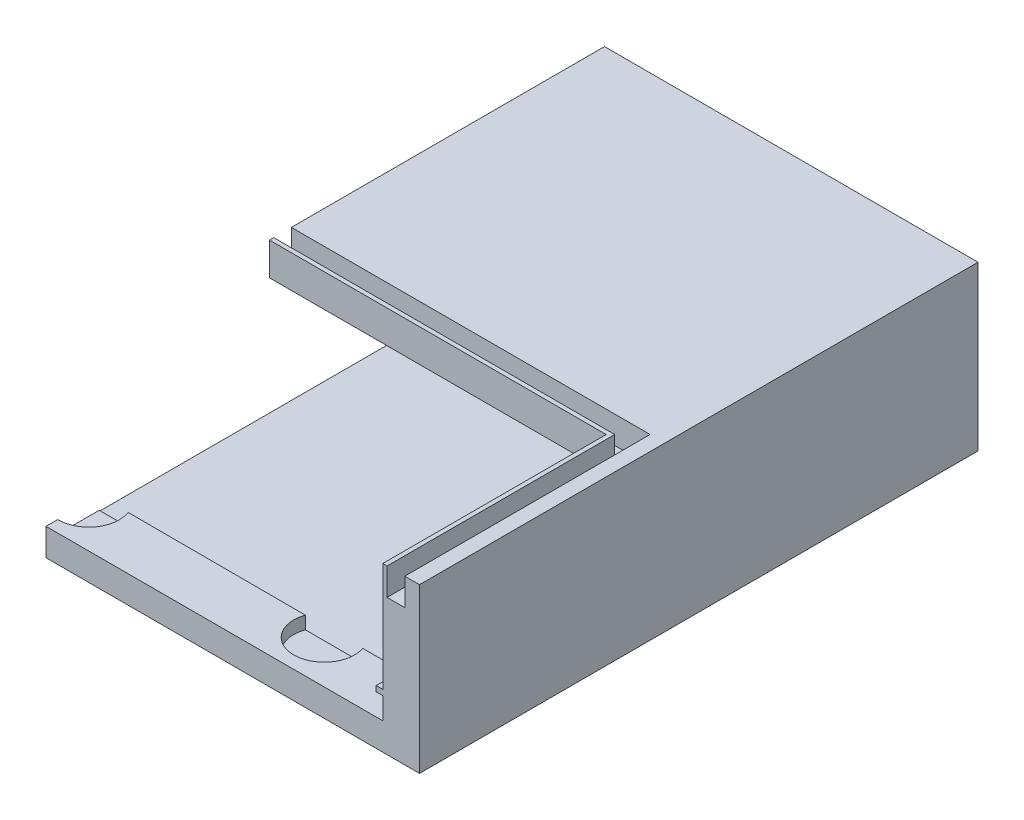
ISO-10303-21;
HEADER;
FILE_DESCRIPTION(('STEP AP214'),'2;1');
FILE_NAME('part.step','',(''),(''),'','','');
FILE_SCHEMA(('AUTOMOTIVE_DESIGN { 1 0 10303 214 1 1 1 1 }'));
ENDSEC;
DATA;
#1=APPLICATION_CONTEXT('core data for automotive mechanical design processes');
#2=APPLICATION_PROTOCOL_DEFINITION('international standard','automotive_design',2000,#1);
#3=PRODUCT_CONTEXT('',#1,'mechanical');
#4=PRODUCT('Part','Part','',(#3));
#5=PRODUCT_RELATED_PRODUCT_CATEGORY('part','',(#4));
#6=PRODUCT_DEFINITION_FORMATION('','',#4);
#7=PRODUCT_DEFINITION_CONTEXT('part definition',#1,'design');
#8=PRODUCT_DEFINITION('design','',#6,#7);
#9=PRODUCT_DEFINITION_SHAPE('','',#8);
#10=(LENGTH_UNIT() NAMED_UNIT(*) SI_UNIT(.MILLI.,.METRE.));
#11=(NAMED_UNIT(*) PLANE_ANGLE_UNIT() SI_UNIT($,.RADIAN.));
#12=(NAMED_UNIT(*) SI_UNIT($,.STERADIAN.) SOLID_ANGLE_UNIT());
#13=UNCERTAINTY_MEASURE_WITH_UNIT(LENGTH_MEASURE(1.E-05),#10,'distance_accuracy_value','');
#14=(GEOMETRIC_REPRESENTATION_CONTEXT(3) GLOBAL_UNCERTAINTY_ASSIGNED_CONTEXT((#13)) GLOBAL_UNIT_ASSIGNED_CONTEXT((#10,
#11,#12)) REPRESENTATION_CONTEXT('',''));
#15=CARTESIAN_POINT('',(0.,0.,0.));
#16=DIRECTION('',(0.,0.,1.));
#17=DIRECTION('',(1.,0.,0.));
#18=AXIS2_PLACEMENT_3D('',#15,#16,#17);
#19=CARTESIAN_POINT('',(0.,0.,8.));
#20=DIRECTION('',(0.,0.,1.));
#21=DIRECTION('',(1.,0.,0.));
#22=AXIS2_PLACEMENT_3D('',#19,#20,#21);
#23=PLANE('',#22);
#24=DIRECTION('',(0.,-1.,0.));
#25=VECTOR('',#24,1.);
#26=CARTESIAN_POINT('',(252.821761464714,9.99999999999999,8.));
#27=LINE('',#26,#25);
#28=CARTESIAN_POINT('',(252.821761464714,20.,8.));
#29=VERTEX_POINT('',#28);
#30=CARTESIAN_POINT('',(252.821761464714,18.,8.));
#31=VERTEX_POINT('',#30);
#32=EDGE_CURVE('E415',#29,#31,#27,.T.);
#33=ORIENTED_EDGE('',*,*,#32,.F.);
#34=DIRECTION('',(-1.,0.,0.));
#35=VECTOR('',#34,1.);
#36=CARTESIAN_POINT('',(255.25,20.,8.));
#37=LINE('',#36,#35);
#38=CARTESIAN_POINT('',(255.25,20.,8.));
#39=VERTEX_POINT('',#38);
#40=EDGE_CURVE('E291',#39,#29,#37,.T.);
#41=ORIENTED_EDGE('',*,*,#40,.F.);
#42=DIRECTION('',(0.,1.,0.));
#43=VECTOR('',#42,1.);
#44=CARTESIAN_POINT('',(255.25,9.99999999999999,8.));
#45=LINE('',#44,#43);
#46=CARTESIAN_POINT('',(255.25,18.,8.));
#47=VERTEX_POINT('',#46);
#48=EDGE_CURVE('E275',#47,#39,#45,.T.);
#49=ORIENTED_EDGE('',*,*,#48,.F.);
#50=DIRECTION('',(1.,0.,0.));
#51=VECTOR('',#50,1.);
#52=CARTESIAN_POINT('',(255.25,18.,8.));
#53=LINE('',#52,#51);
#54=EDGE_CURVE('E295',#31,#47,#53,.T.);
#55=ORIENTED_EDGE('',*,*,#54,.F.);
#56=EDGE_LOOP('',(#33,#41,#49,#55));
#57=FACE_BOUND('',#56,.T.);
#58=ADVANCED_FACE('F43',(#57),#23,.F.);
#59=CARTESIAN_POINT('',(252.821761464714,18.,5.00000000000006));
#60=DIRECTION('',(0.,1.,0.));
#61=DIRECTION('',(0.,0.,1.));
#62=AXIS2_PLACEMENT_3D('',#59,#60,#61);
#63=PLANE('',#62);
#64=DIRECTION('',(0.,0.,1.));
#65=VECTOR('',#64,1.);
#66=CARTESIAN_POINT('',(252.821761464714,18.,5.00000000000006));
#67=LINE('',#66,#65);
#68=CARTESIAN_POINT('',(252.821761464714,18.,90.0000000000001));
#69=VERTEX_POINT('',#68);
#70=EDGE_CURVE('E289',#31,#69,#67,.T.);
#71=ORIENTED_EDGE('',*,*,#70,.F.);
#72=ORIENTED_EDGE('',*,*,#54,.T.);
#73=DIRECTION('',(0.,0.,1.));
#74=VECTOR('',#73,1.);
#75=CARTESIAN_POINT('',(255.25,18.,8.));
#76=LINE('',#75,#74);
#77=CARTESIAN_POINT('',(255.25,18.,90.));
#78=VERTEX_POINT('',#77);
#79=EDGE_CURVE('E412',#47,#78,#76,.T.);
#80=ORIENTED_EDGE('',*,*,#79,.T.);
#81=DIRECTION('',(-1.,0.,0.));
#82=VECTOR('',#81,1.);
#83=CARTESIAN_POINT('',(252.821761464714,18.,90.0000000000001));
#84=LINE('',#83,#82);
#85=EDGE_CURVE('E285',#78,#69,#84,.T.);
#86=ORIENTED_EDGE('',*,*,#85,.T.);
#87=EDGE_LOOP('',(#71,#72,#80,#86));
#88=FACE_BOUND('',#87,.T.);
#89=ADVANCED_FACE('F535',(#88),#63,.F.);
#90=CARTESIAN_POINT('',(252.821761464714,20.,5.00000000000006));
#91=DIRECTION('',(1.,0.,0.));
#92=DIRECTION('',(0.,0.,-1.));
#93=AXIS2_PLACEMENT_3D('',#90,#91,#92);
#94=PLANE('',#93);
#95=DIRECTION('',(0.,0.,1.));
#96=VECTOR('',#95,1.);
#97=CARTESIAN_POINT('',(252.821761464714,20.,5.00000000000006));
#98=LINE('',#97,#96);
#99=CARTESIAN_POINT('',(252.821761464714,20.,90.0000000000001));
#100=VERTEX_POINT('',#99);
#101=EDGE_CURVE('E288',#29,#100,#98,.T.);
#102=ORIENTED_EDGE('',*,*,#101,.F.);
#103=ORIENTED_EDGE('',*,*,#32,.T.);
#104=ORIENTED_EDGE('',*,*,#70,.T.);
#105=DIRECTION('',(0.,1.,0.));
#106=VECTOR('',#105,1.);
#107=CARTESIAN_POINT('',(252.821761464714,20.,90.0000000000001));
#108=LINE('',#107,#106);
#109=EDGE_CURVE('E282',#69,#100,#108,.T.);
#110=ORIENTED_EDGE('',*,*,#109,.T.);
#111=EDGE_LOOP('',(#102,#103,#104,#110));
#112=FACE_BOUND('',#111,.T.);
#113=ADVANCED_FACE('F532',(#112),#94,.F.);
#114=CARTESIAN_POINT('',(255.25,20.,5.00000000000007));
#115=DIRECTION('',(0.,-1.,0.));
#116=DIRECTION('',(0.,0.,-1.));
#117=AXIS2_PLACEMENT_3D('',#114,#115,#116);
#118=PLANE('',#117);
#119=DIRECTION('',(0.,0.,-1.));
#120=VECTOR('',#119,1.);
#121=CARTESIAN_POINT('',(255.25,20.,8.));
#122=LINE('',#121,#120);
#123=CARTESIAN_POINT('',(255.25,20.,90.0000000000001));
#124=VERTEX_POINT('',#123);
#125=EDGE_CURVE('E409',#124,#39,#122,.T.);
#126=ORIENTED_EDGE('',*,*,#125,.T.);
#127=ORIENTED_EDGE('',*,*,#40,.T.);
#128=ORIENTED_EDGE('',*,*,#101,.T.);
#129=DIRECTION('',(1.,0.,0.));
#130=VECTOR('',#129,1.);
#131=CARTESIAN_POINT('',(255.25,20.,90.0000000000001));
#132=LINE('',#131,#130);
#133=EDGE_CURVE('E278',#100,#124,#132,.T.);
#134=ORIENTED_EDGE('',*,*,#133,.T.);
#135=EDGE_LOOP('',(#126,#127,#128,#134));
#136=FACE_BOUND('',#135,.T.);
#137=ADVANCED_FACE('F529',(#136),#118,.F.);
#138=CARTESIAN_POINT('',(217.983549657202,5.33999999999999,74.2641238187744));
#139=DIRECTION('',(0.,1.,0.));
#140=DIRECTION('',(0.,0.,1.));
#141=AXIS2_PLACEMENT_3D('',#138,#139,#140);
#142=PLANE('',#141);
#143=DIRECTION('',(0.999998237049616,0.,0.00187773737807381));
#144=VECTOR('',#143,1.);
#145=CARTESIAN_POINT('',(217.990341077188,5.33999999999999,70.6473198433544));
#146=LINE('',#145,#144);
#147=CARTESIAN_POINT('',(207.443266096182,5.33999999999999,70.6275151715185));
#148=VERTEX_POINT('',#147);
#149=CARTESIAN_POINT('',(228.537416058195,5.33999999999999,70.6671245151902));
#150=VERTEX_POINT('',#149);
#151=EDGE_CURVE('E405',#148,#150,#146,.T.);
#152=ORIENTED_EDGE('',*,*,#151,.F.);
#153=CARTESIAN_POINT('',(217.983549657202,5.33999999999999,74.2641238187744));
#154=DIRECTION('',(0.,1.,0.));
#155=DIRECTION('',(0.,0.,1.));
#156=AXIS2_PLACEMENT_3D('',#153,#154,#155);
#157=CIRCLE('',#156,11.15);
#158=EDGE_CURVE('E327',#148,#150,#157,.T.);
#159=ORIENTED_EDGE('',*,*,#158,.T.);
#160=EDGE_LOOP('',(#152,#159));
#161=FACE_BOUND('',#160,.T.);
#162=ADVANCED_FACE('F601',(#161),#142,.T.);
#163=CARTESIAN_POINT('',(217.983549657202,5.33999999999999,74.2641238187744));
#164=DIRECTION('',(0.,1.,0.));
#165=DIRECTION('',(0.,0.,1.));
#166=AXIS2_PLACEMENT_3D('',#163,#164,#165);
#167=CYLINDRICAL_SURFACE('',#166,11.15);
#168=CARTESIAN_POINT('',(217.983549657202,9.99999999999999,74.2641238187744));
#169=DIRECTION('',(0.,1.,0.));
#170=DIRECTION('',(0.,0.,1.));
#171=AXIS2_PLACEMENT_3D('',#168,#169,#170);
#172=CIRCLE('',#171,11.15);
#173=CARTESIAN_POINT('',(207.443266096182,9.99999999999999,70.6275151715185));
#174=VERTEX_POINT('',#173);
#175=CARTESIAN_POINT('',(228.537416058195,9.99999999999999,70.6671245151902));
#176=VERTEX_POINT('',#175);
#177=EDGE_CURVE('E328',#174,#176,#172,.T.);
#178=ORIENTED_EDGE('',*,*,#177,.T.);
#179=DIRECTION('',(0.,1.,0.));
#180=VECTOR('',#179,1.);
#181=CARTESIAN_POINT('',(228.537416058195,5.33999999999999,70.6671245151902));
#182=LINE('',#181,#180);
#183=EDGE_CURVE('E318',#176,#150,#182,.F.);
#184=ORIENTED_EDGE('',*,*,#183,.T.);
#185=ORIENTED_EDGE('',*,*,#158,.F.);
#186=DIRECTION('',(0.,1.,0.));
#187=VECTOR('',#186,1.);
#188=CARTESIAN_POINT('',(207.443266096182,5.33999999999999,70.6275151715185));
#189=LINE('',#188,#187);
#190=EDGE_CURVE('E313',#148,#174,#189,.T.);
#191=ORIENTED_EDGE('',*,*,#190,.T.);
#192=EDGE_LOOP('',(#178,#184,#185,#191));
#193=FACE_BOUND('',#192,.T.);
#194=ADVANCED_FACE('F606',(#193),#167,.F.);
#195=CARTESIAN_POINT('',(0.,9.99999999999999,0.));
#196=DIRECTION('',(0.,1.,0.));
#197=DIRECTION('',(0.,0.,1.));
#198=AXIS2_PLACEMENT_3D('',#195,#196,#197);
#199=PLANE('',#198);
#200=DIRECTION('',(0.,0.,-1.));
#201=VECTOR('',#200,1.);
#202=CARTESIAN_POINT('',(131.625,9.99999999999999,0.));
#203=LINE('',#202,#201);
#204=CARTESIAN_POINT('',(131.625,9.99999999999999,90.));
#205=VERTEX_POINT('',#204);
#206=CARTESIAN_POINT('',(131.625,9.99999999999999,85.6696744542363));
#207=VERTEX_POINT('',#206);
#208=EDGE_CURVE('E452',#205,#207,#203,.T.);
#209=ORIENTED_EDGE('',*,*,#208,.F.);
#210=DIRECTION('',(1.,0.,0.));
#211=VECTOR('',#210,1.);
#212=CARTESIAN_POINT('',(8.00000000000001,9.99999999999999,90.));
#213=LINE('',#212,#211);
#214=CARTESIAN_POINT('',(255.25,9.99999999999999,90.));
#215=VERTEX_POINT('',#214);
#216=EDGE_CURVE('E338',#205,#215,#213,.T.);
#217=ORIENTED_EDGE('',*,*,#216,.T.);
#218=DIRECTION('',(0.,0.,-1.));
#219=VECTOR('',#218,1.);
#220=CARTESIAN_POINT('',(255.25,9.99999999999999,8.));
#221=LINE('',#220,#219);
#222=CARTESIAN_POINT('',(255.25,9.99999999999999,70.717283820951));
#223=VERTEX_POINT('',#222);
#224=EDGE_CURVE('E340',#215,#223,#221,.T.);
#225=ORIENTED_EDGE('',*,*,#224,.T.);
#226=DIRECTION('',(0.999998237049615,0.,0.00187773737807381));
#227=VECTOR('',#226,1.);
#228=CARTESIAN_POINT('',(8.,9.99999999999999,70.2530124357349));
#229=LINE('',#228,#227);
#230=EDGE_CURVE('E298',#176,#223,#229,.T.);
#231=ORIENTED_EDGE('',*,*,#230,.F.);
#232=ORIENTED_EDGE('',*,*,#177,.F.);
#233=CARTESIAN_POINT('',(142.259030889935,9.99999999999999,70.5051160808271));
#234=VERTEX_POINT('',#233);
#235=EDGE_CURVE('E309',#234,#174,#229,.T.);
#236=ORIENTED_EDGE('',*,*,#235,.F.);
#237=CARTESIAN_POINT('',(131.857766280656,9.99999999999999,74.522104321755));
#238=DIRECTION('',(0.,1.,0.));
#239=DIRECTION('',(0.,0.,1.));
#240=AXIS2_PLACEMENT_3D('',#237,#238,#239);
#241=CIRCLE('',#240,11.15);
#242=EDGE_CURVE('E331',#207,#234,#241,.T.);
#243=ORIENTED_EDGE('',*,*,#242,.F.);
#244=EDGE_LOOP('',(#209,#217,#225,#231,#232,#236,#243));
#245=FACE_BOUND('',#244,.T.);
#246=ADVANCED_FACE('F542',(#245),#199,.T.);
#247=CARTESIAN_POINT('',(131.857766280656,5.33999999999999,74.522104321755));
#248=DIRECTION('',(0.,1.,0.));
#249=DIRECTION('',(0.,0.,1.));
#250=AXIS2_PLACEMENT_3D('',#247,#248,#249);
#251=CYLINDRICAL_SURFACE('',#250,11.15);
#252=CARTESIAN_POINT('',(131.857766280656,5.33999999999999,74.522104321755));
#253=DIRECTION('',(0.,1.,0.));
#254=DIRECTION('',(0.,0.,1.));
#255=AXIS2_PLACEMENT_3D('',#252,#253,#254);
#256=CIRCLE('',#255,11.15);
#257=CARTESIAN_POINT('',(131.625,5.33999999999999,85.6696744542363));
#258=VERTEX_POINT('',#257);
#259=CARTESIAN_POINT('',(142.259030889935,5.33999999999999,70.5051160808271));
#260=VERTEX_POINT('',#259);
#261=EDGE_CURVE('E334',#258,#260,#256,.T.);
#262=ORIENTED_EDGE('',*,*,#261,.F.);
#263=DIRECTION('',(0.,1.,0.));
#264=VECTOR('',#263,1.);
#265=CARTESIAN_POINT('',(131.625,5.33999999999999,85.6696744542363));
#266=LINE('',#265,#264);
#267=EDGE_CURVE('E448',#258,#207,#266,.T.);
#268=ORIENTED_EDGE('',*,*,#267,.T.);
#269=ORIENTED_EDGE('',*,*,#242,.T.);
#270=DIRECTION('',(0.,1.,0.));
#271=VECTOR('',#270,1.);
#272=CARTESIAN_POINT('',(142.259030889935,5.33999999999999,70.5051160808271));
#273=LINE('',#272,#271);
#274=EDGE_CURVE('E324',#234,#260,#273,.F.);
#275=ORIENTED_EDGE('',*,*,#274,.T.);
#276=EDGE_LOOP('',(#262,#268,#269,#275));
#277=FACE_BOUND('',#276,.T.);
#278=ADVANCED_FACE('F551',(#277),#251,.F.);
#279=CARTESIAN_POINT('',(131.857766280656,5.33999999999999,74.522104321755));
#280=DIRECTION('',(0.,1.,0.));
#281=DIRECTION('',(0.,0.,1.));
#282=AXIS2_PLACEMENT_3D('',#279,#280,#281);
#283=PLANE('',#282);
#284=DIRECTION('',(0.,0.,-1.));
#285=VECTOR('',#284,1.);
#286=CARTESIAN_POINT('',(131.625,5.33999999999999,74.522104321755));
#287=LINE('',#286,#285);
#288=CARTESIAN_POINT('',(131.625,5.33999999999999,70.485148128343));
#289=VERTEX_POINT('',#288);
#290=EDGE_CURVE('E428',#258,#289,#287,.T.);
#291=ORIENTED_EDGE('',*,*,#290,.F.);
#292=ORIENTED_EDGE('',*,*,#261,.T.);
#293=DIRECTION('',(0.999998237049616,0.,0.00187773737807381));
#294=VECTOR('',#293,1.);
#295=CARTESIAN_POINT('',(131.86534579012,5.33999999999999,70.4855994354124));
#296=LINE('',#295,#294);
#297=EDGE_CURVE('E321',#289,#260,#296,.T.);
#298=ORIENTED_EDGE('',*,*,#297,.F.);
#299=EDGE_LOOP('',(#291,#292,#298));
#300=FACE_BOUND('',#299,.T.);
#301=ADVANCED_FACE('F554',(#300),#283,.T.);
#302=CARTESIAN_POINT('',(0.,60.,0.));
#303=DIRECTION('',(0.,-1.,0.));
#304=DIRECTION('',(0.,0.,-1.));
#305=AXIS2_PLACEMENT_3D('',#302,#303,#304);
#306=PLANE('',#305);
#307=DIRECTION('',(1.,0.,0.));
#308=VECTOR('',#307,1.);
#309=CARTESIAN_POINT('',(4.98139206480159,60.,6.43875543881975));
#310=LINE('',#309,#308);
#311=CARTESIAN_POINT('',(131.625,60.,6.43875543881975));
#312=VERTEX_POINT('',#311);
#313=CARTESIAN_POINT('',(256.811190638833,60.,6.43875543881975));
#314=VERTEX_POINT('',#313);
#315=EDGE_CURVE('E357',#312,#314,#310,.T.);
#316=ORIENTED_EDGE('',*,*,#315,.F.);
#317=DIRECTION('',(0.,0.,1.));
#318=VECTOR('',#317,1.);
#319=CARTESIAN_POINT('',(131.625,60.,0.));
#320=LINE('',#319,#318);
#321=CARTESIAN_POINT('',(131.625,60.,8.));
#322=VERTEX_POINT('',#321);
#323=EDGE_CURVE('E443',#312,#322,#320,.T.);
#324=ORIENTED_EDGE('',*,*,#323,.T.);
#325=DIRECTION('',(-1.,0.,0.));
#326=VECTOR('',#325,1.);
#327=CARTESIAN_POINT('',(255.25,60.,8.));
#328=LINE('',#327,#326);
#329=CARTESIAN_POINT('',(255.25,60.,8.));
#330=VERTEX_POINT('',#329);
#331=EDGE_CURVE('E336',#330,#322,#328,.T.);
#332=ORIENTED_EDGE('',*,*,#331,.F.);
#333=DIRECTION('',(0.,0.,-1.));
#334=VECTOR('',#333,1.);
#335=CARTESIAN_POINT('',(255.25,60.,8.));
#336=LINE('',#335,#334);
#337=CARTESIAN_POINT('',(255.25,60.,90.));
#338=VERTEX_POINT('',#337);
#339=EDGE_CURVE('E341',#338,#330,#336,.T.);
#340=ORIENTED_EDGE('',*,*,#339,.F.);
#341=DIRECTION('',(-1.,0.,0.));
#342=VECTOR('',#341,1.);
#343=CARTESIAN_POINT('',(268.719836563698,60.,90.));
#344=LINE('',#343,#342);
#345=CARTESIAN_POINT('',(256.811190638833,60.,90.));
#346=VERTEX_POINT('',#345);
#347=EDGE_CURVE('E389',#346,#338,#344,.T.);
#348=ORIENTED_EDGE('',*,*,#347,.F.);
#349=DIRECTION('',(0.,0.,1.));
#350=VECTOR('',#349,1.);
#351=CARTESIAN_POINT('',(256.811190638833,60.,6.43875543881975));
#352=LINE('',#351,#350);
#353=EDGE_CURVE('E373',#314,#346,#352,.T.);
#354=ORIENTED_EDGE('',*,*,#353,.F.);
#355=EDGE_LOOP('',(#316,#324,#332,#340,#348,#354));
#356=FACE_BOUND('',#355,.T.);
#357=ADVANCED_FACE('F522',(#356),#306,.F.);
#358=CARTESIAN_POINT('',(-2.56783199264043,50.,-0.0612445611802538));
#359=DIRECTION('',(0.,0.,1.));
#360=DIRECTION('',(1.,0.,0.));
#361=AXIS2_PLACEMENT_3D('',#358,#359,#360);
#362=PLANE('',#361);
#363=DIRECTION('',(0.,1.,0.));
#364=VECTOR('',#363,1.);
#365=CARTESIAN_POINT('',(131.625,50.,-0.0612445611802554));
#366=LINE('',#365,#364);
#367=CARTESIAN_POINT('',(131.625,50.,-0.0612445611802554));
#368=VERTEX_POINT('',#367);
#369=CARTESIAN_POINT('',(131.625,60.,-0.0612445611802554));
#370=VERTEX_POINT('',#369);
#371=EDGE_CURVE('E453',#368,#370,#366,.T.);
#372=ORIENTED_EDGE('',*,*,#371,.F.);
#373=DIRECTION('',(1.,0.,0.));
#374=VECTOR('',#373,1.);
#375=CARTESIAN_POINT('',(-2.56783199264043,50.,-0.0612445611802538));
#376=LINE('',#375,#374);
#377=CARTESIAN_POINT('',(263.311190638833,50.,-0.061244561180257));
#378=VERTEX_POINT('',#377);
#379=EDGE_CURVE('E354',#368,#378,#376,.T.);
#380=ORIENTED_EDGE('',*,*,#379,.T.);
#381=DIRECTION('',(0.,1.,0.));
#382=VECTOR('',#381,1.);
#383=CARTESIAN_POINT('',(263.311190638833,50.,-0.061244561180257));
#384=LINE('',#383,#382);
#385=CARTESIAN_POINT('',(263.311190638833,60.,-0.061244561180257));
#386=VERTEX_POINT('',#385);
#387=EDGE_CURVE('E383',#378,#386,#384,.T.);
#388=ORIENTED_EDGE('',*,*,#387,.T.);
#389=DIRECTION('',(1.,0.,0.));
#390=VECTOR('',#389,1.);
#391=CARTESIAN_POINT('',(-2.56783199264043,60.,-0.0612445611802538));
#392=LINE('',#391,#390);
#393=EDGE_CURVE('E351',#370,#386,#392,.T.);
#394=ORIENTED_EDGE('',*,*,#393,.F.);
#395=EDGE_LOOP('',(#372,#380,#388,#394));
#396=FACE_BOUND('',#395,.T.);
#397=ADVANCED_FACE('F638',(#396),#362,.T.);
#398=CARTESIAN_POINT('',(263.311190638833,50.,90.));
#399=DIRECTION('',(1.,0.,0.));
#400=DIRECTION('',(0.,0.,-1.));
#401=AXIS2_PLACEMENT_3D('',#398,#399,#400);
#402=PLANE('',#401);
#403=DIRECTION('',(0.,0.,-1.));
#404=VECTOR('',#403,1.);
#405=CARTESIAN_POINT('',(263.311190638833,60.,90.));
#406=LINE('',#405,#404);
#407=CARTESIAN_POINT('',(263.311190638833,60.,90.));
#408=VERTEX_POINT('',#407);
#409=EDGE_CURVE('E370',#408,#386,#406,.T.);
#410=ORIENTED_EDGE('',*,*,#409,.T.);
#411=ORIENTED_EDGE('',*,*,#387,.F.);
#412=DIRECTION('',(0.,0.,-1.));
#413=VECTOR('',#412,1.);
#414=CARTESIAN_POINT('',(263.311190638833,50.,90.));
#415=LINE('',#414,#413);
#416=CARTESIAN_POINT('',(263.311190638833,50.,90.));
#417=VERTEX_POINT('',#416);
#418=EDGE_CURVE('E356',#417,#378,#415,.T.);
#419=ORIENTED_EDGE('',*,*,#418,.F.);
#420=DIRECTION('',(0.,1.,0.));
#421=VECTOR('',#420,1.);
#422=CARTESIAN_POINT('',(263.311190638833,50.,90.));
#423=LINE('',#422,#421);
#424=EDGE_CURVE('E381',#417,#408,#423,.T.);
#425=ORIENTED_EDGE('',*,*,#424,.T.);
#426=EDGE_LOOP('',(#410,#411,#419,#425));
#427=FACE_BOUND('',#426,.T.);
#428=ADVANCED_FACE('F506',(#427),#402,.F.);
#429=DIRECTION('',(1.,0.,0.));
#430=VECTOR('',#429,1.);
#431=CARTESIAN_POINT('',(-5.2976725084512,60.,-115.));
#432=LINE('',#431,#430);
#433=CARTESIAN_POINT('',(131.625,60.,-115.));
#434=VERTEX_POINT('',#433);
#435=CARTESIAN_POINT('',(268.719836563698,60.,-115.));
#436=VERTEX_POINT('',#435);
#437=EDGE_CURVE('E394',#434,#436,#432,.T.);
#438=ORIENTED_EDGE('',*,*,#437,.F.);
#439=DIRECTION('',(0.,0.,1.));
#440=VECTOR('',#439,1.);
#441=CARTESIAN_POINT('',(131.625,60.,0.));
#442=LINE('',#441,#440);
#443=EDGE_CURVE('E445',#434,#370,#442,.T.);
#444=ORIENTED_EDGE('',*,*,#443,.T.);
#445=ORIENTED_EDGE('',*,*,#393,.T.);
#446=ORIENTED_EDGE('',*,*,#409,.F.);
#447=CARTESIAN_POINT('',(268.719836563698,60.,90.));
#448=VERTEX_POINT('',#447);
#449=EDGE_CURVE('E391',#448,#408,#344,.T.);
#450=ORIENTED_EDGE('',*,*,#449,.F.);
#451=DIRECTION('',(0.,0.,1.));
#452=VECTOR('',#451,1.);
#453=CARTESIAN_POINT('',(268.719836563698,60.,-109.817232955472));
#454=LINE('',#453,#452);
#455=EDGE_CURVE('E387',#436,#448,#454,.T.);
#456=ORIENTED_EDGE('',*,*,#455,.F.);
#457=EDGE_LOOP('',(#438,#444,#445,#446,#450,#456));
#458=FACE_BOUND('',#457,.T.);
#459=ADVANCED_FACE('F501',(#458),#306,.F.);
#460=CARTESIAN_POINT('',(0.,60.,90.));
#461=DIRECTION('',(0.,0.,1.));
#462=DIRECTION('',(1.,0.,0.));
#463=AXIS2_PLACEMENT_3D('',#460,#461,#462);
#464=PLANE('',#463);
#465=DIRECTION('',(0.,1.,0.));
#466=VECTOR('',#465,1.);
#467=CARTESIAN_POINT('',(131.624999999999,60.0000000000012,90.));
#468=LINE('',#467,#466);
#469=CARTESIAN_POINT('',(131.625,0.,90.));
#470=VERTEX_POINT('',#469);
#471=EDGE_CURVE('E429',#470,#205,#468,.T.);
#472=ORIENTED_EDGE('',*,*,#471,.F.);
#473=DIRECTION('',(-1.,0.,0.));
#474=VECTOR('',#473,1.);
#475=CARTESIAN_POINT('',(0.,0.,90.));
#476=LINE('',#475,#474);
#477=CARTESIAN_POINT('',(268.719836563698,0.,90.));
#478=VERTEX_POINT('',#477);
#479=EDGE_CURVE('E386',#478,#470,#476,.T.);
#480=ORIENTED_EDGE('',*,*,#479,.F.);
#481=DIRECTION('',(0.,-1.,0.));
#482=VECTOR('',#481,1.);
#483=CARTESIAN_POINT('',(268.719836563698,60.,90.));
#484=LINE('',#483,#482);
#485=EDGE_CURVE('E396',#448,#478,#484,.T.);
#486=ORIENTED_EDGE('',*,*,#485,.F.);
#487=ORIENTED_EDGE('',*,*,#449,.T.);
#488=ORIENTED_EDGE('',*,*,#424,.F.);
#489=DIRECTION('',(1.,0.,0.));
#490=VECTOR('',#489,1.);
#491=CARTESIAN_POINT('',(256.811190638833,50.,90.));
#492=LINE('',#491,#490);
#493=CARTESIAN_POINT('',(256.811190638833,50.,90.));
#494=VERTEX_POINT('',#493);
#495=EDGE_CURVE('E360',#494,#417,#492,.T.);
#496=ORIENTED_EDGE('',*,*,#495,.F.);
#497=DIRECTION('',(0.,1.,0.));
#498=VECTOR('',#497,1.);
#499=CARTESIAN_POINT('',(256.811190638833,50.,90.));
#500=LINE('',#499,#498);
#501=EDGE_CURVE('E378',#494,#346,#500,.T.);
#502=ORIENTED_EDGE('',*,*,#501,.T.);
#503=ORIENTED_EDGE('',*,*,#347,.T.);
#504=DIRECTION('',(0.,1.,0.));
#505=VECTOR('',#504,1.);
#506=CARTESIAN_POINT('',(255.25,9.99999999999999,90.));
#507=LINE('',#506,#505);
#508=EDGE_CURVE('E344',#124,#338,#507,.T.);
#509=ORIENTED_EDGE('',*,*,#508,.F.);
#510=ORIENTED_EDGE('',*,*,#133,.F.);
#511=ORIENTED_EDGE('',*,*,#109,.F.);
#512=ORIENTED_EDGE('',*,*,#85,.F.);
#513=EDGE_CURVE('E352',#215,#78,#507,.T.);
#514=ORIENTED_EDGE('',*,*,#513,.F.);
#515=ORIENTED_EDGE('',*,*,#216,.F.);
#516=EDGE_LOOP('',(#472,#480,#486,#487,#488,#496,#502,#503,#509,#510,#511,#512,#514,#515));
#517=FACE_BOUND('',#516,.T.);
#518=ADVANCED_FACE('F493',(#517),#464,.T.);
#519=CARTESIAN_POINT('',(268.719836563698,60.,-115.));
#520=DIRECTION('',(1.,0.,0.));
#521=DIRECTION('',(0.,0.,-1.));
#522=AXIS2_PLACEMENT_3D('',#519,#520,#521);
#523=PLANE('',#522);
#524=DIRECTION('',(0.,0.,1.));
#525=VECTOR('',#524,1.);
#526=CARTESIAN_POINT('',(268.719836563698,0.,-115.));
#527=LINE('',#526,#525);
#528=CARTESIAN_POINT('',(268.719836563698,0.,-115.));
#529=VERTEX_POINT('',#528);
#530=EDGE_CURVE('E390',#529,#478,#527,.T.);
#531=ORIENTED_EDGE('',*,*,#530,.F.);
#532=DIRECTION('',(0.,-1.,0.));
#533=VECTOR('',#532,1.);
#534=CARTESIAN_POINT('',(268.719836563698,60.,-115.));
#535=LINE('',#534,#533);
#536=EDGE_CURVE('E402',#436,#529,#535,.T.);
#537=ORIENTED_EDGE('',*,*,#536,.F.);
#538=ORIENTED_EDGE('',*,*,#455,.T.);
#539=ORIENTED_EDGE('',*,*,#485,.T.);
#540=EDGE_LOOP('',(#531,#537,#538,#539));
#541=FACE_BOUND('',#540,.T.);
#542=ADVANCED_FACE('F496',(#541),#523,.T.);
#543=CARTESIAN_POINT('',(-5.2976725084512,60.,-115.));
#544=DIRECTION('',(0.,0.,-1.));
#545=DIRECTION('',(-1.,0.,0.));
#546=AXIS2_PLACEMENT_3D('',#543,#544,#545);
#547=PLANE('',#546);
#548=DIRECTION('',(0.,-1.,0.));
#549=VECTOR('',#548,1.);
#550=CARTESIAN_POINT('',(131.624999999999,60.0000000000012,-115.));
#551=LINE('',#550,#549);
#552=CARTESIAN_POINT('',(131.625,24.5796502381768,-115.));
#553=VERTEX_POINT('',#552);
#554=CARTESIAN_POINT('',(131.625,0.,-115.));
#555=VERTEX_POINT('',#554);
#556=EDGE_CURVE('E47',#553,#555,#551,.T.);
#557=ORIENTED_EDGE('',*,*,#556,.F.);
#558=DIRECTION('',(-0.866025403784441,0.499999999999997,0.));
#559=VECTOR('',#558,1.);
#560=CARTESIAN_POINT('',(13.5955342663267,92.7239940518201,-115.));
#561=LINE('',#560,#559);
#562=CARTESIAN_POINT('',(142.996381437181,18.0143801043625,-115.));
#563=VERTEX_POINT('',#562);
#564=EDGE_CURVE('E467',#563,#553,#561,.T.);
#565=ORIENTED_EDGE('',*,*,#564,.F.);
#566=DIRECTION('',(0.,-1.,0.));
#567=VECTOR('',#566,1.);
#568=CARTESIAN_POINT('',(142.996381437181,60.,-115.));
#569=LINE('',#568,#567);
#570=CARTESIAN_POINT('',(142.996381437181,44.5862853397348,-115.));
#571=VERTEX_POINT('',#570);
#572=EDGE_CURVE('E464',#571,#563,#569,.T.);
#573=ORIENTED_EDGE('',*,*,#572,.F.);
#574=DIRECTION('',(0.86602540378444,0.499999999999997,0.));
#575=VECTOR('',#574,1.);
#576=CARTESIAN_POINT('',(38.4501752091935,-15.7734949687474,-115.));
#577=LINE('',#576,#575);
#578=CARTESIAN_POINT('',(131.625,38.0210152059206,-115.));
#579=VERTEX_POINT('',#578);
#580=EDGE_CURVE('E461',#579,#571,#577,.T.);
#581=ORIENTED_EDGE('',*,*,#580,.F.);
#582=DIRECTION('',(0.,-1.,0.));
#583=VECTOR('',#582,1.);
#584=CARTESIAN_POINT('',(131.625,60.,-115.));
#585=LINE('',#584,#583);
#586=EDGE_CURVE('E458',#434,#579,#585,.T.);
#587=ORIENTED_EDGE('',*,*,#586,.F.);
#588=ORIENTED_EDGE('',*,*,#437,.T.);
#589=ORIENTED_EDGE('',*,*,#536,.T.);
#590=DIRECTION('',(1.,0.,0.));
#591=VECTOR('',#590,1.);
#592=CARTESIAN_POINT('',(-5.2976725084512,0.,-115.));
#593=LINE('',#592,#591);
#594=EDGE_CURVE('E399',#555,#529,#593,.T.);
#595=ORIENTED_EDGE('',*,*,#594,.F.);
#596=EDGE_LOOP('',(#557,#565,#573,#581,#587,#588,#589,#595));
#597=FACE_BOUND('',#596,.T.);
#598=ADVANCED_FACE('F646',(#597),#547,.T.);
#599=CARTESIAN_POINT('',(0.,0.,0.));
#600=DIRECTION('',(0.,-1.,0.));
#601=DIRECTION('',(0.,0.,-1.));
#602=AXIS2_PLACEMENT_3D('',#599,#600,#601);
#603=PLANE('',#602);
#604=DIRECTION('',(0.,0.,1.));
#605=VECTOR('',#604,1.);
#606=CARTESIAN_POINT('',(131.625,0.,0.));
#607=LINE('',#606,#605);
#608=EDGE_CURVE('E456',#555,#470,#607,.T.);
#609=ORIENTED_EDGE('',*,*,#608,.F.);
#610=ORIENTED_EDGE('',*,*,#594,.T.);
#611=ORIENTED_EDGE('',*,*,#530,.T.);
#612=ORIENTED_EDGE('',*,*,#479,.T.);
#613=EDGE_LOOP('',(#609,#610,#611,#612));
#614=FACE_BOUND('',#613,.T.);
#615=ADVANCED_FACE('F489',(#614),#603,.T.);
#616=CARTESIAN_POINT('',(256.811190638833,50.,6.43875543881975));
#617=DIRECTION('',(-1.,0.,0.));
#618=DIRECTION('',(0.,0.,1.));
#619=AXIS2_PLACEMENT_3D('',#616,#617,#618);
#620=PLANE('',#619);
#621=ORIENTED_EDGE('',*,*,#353,.T.);
#622=ORIENTED_EDGE('',*,*,#501,.F.);
#623=DIRECTION('',(0.,0.,1.));
#624=VECTOR('',#623,1.);
#625=CARTESIAN_POINT('',(256.811190638833,50.,6.43875543881975));
#626=LINE('',#625,#624);
#627=CARTESIAN_POINT('',(256.811190638833,50.,6.43875543881975));
#628=VERTEX_POINT('',#627);
#629=EDGE_CURVE('E363',#628,#494,#626,.T.);
#630=ORIENTED_EDGE('',*,*,#629,.F.);
#631=DIRECTION('',(0.,1.,0.));
#632=VECTOR('',#631,1.);
#633=CARTESIAN_POINT('',(256.811190638833,50.,6.43875543881975));
#634=LINE('',#633,#632);
#635=EDGE_CURVE('E368',#628,#314,#634,.T.);
#636=ORIENTED_EDGE('',*,*,#635,.T.);
#637=EDGE_LOOP('',(#621,#622,#630,#636));
#638=FACE_BOUND('',#637,.T.);
#639=ADVANCED_FACE('F515',(#638),#620,.F.);
#640=CARTESIAN_POINT('',(4.98139206480159,50.,6.43875543881975));
#641=DIRECTION('',(0.,0.,1.));
#642=DIRECTION('',(1.,0.,0.));
#643=AXIS2_PLACEMENT_3D('',#640,#641,#642);
#644=PLANE('',#643);
#645=DIRECTION('',(1.,0.,0.));
#646=VECTOR('',#645,1.);
#647=CARTESIAN_POINT('',(4.98139206480159,50.,6.43875543881975));
#648=LINE('',#647,#646);
#649=CARTESIAN_POINT('',(131.625,50.,6.43875543881975));
#650=VERTEX_POINT('',#649);
#651=EDGE_CURVE('E366',#650,#628,#648,.T.);
#652=ORIENTED_EDGE('',*,*,#651,.F.);
#653=DIRECTION('',(0.,1.,0.));
#654=VECTOR('',#653,1.);
#655=CARTESIAN_POINT('',(131.625,50.,6.43875543881975));
#656=LINE('',#655,#654);
#657=EDGE_CURVE('E446',#650,#312,#656,.T.);
#658=ORIENTED_EDGE('',*,*,#657,.T.);
#659=ORIENTED_EDGE('',*,*,#315,.T.);
#660=ORIENTED_EDGE('',*,*,#635,.F.);
#661=EDGE_LOOP('',(#652,#658,#659,#660));
#662=FACE_BOUND('',#661,.T.);
#663=ADVANCED_FACE('F630',(#662),#644,.F.);
#664=CARTESIAN_POINT('',(0.,50.,0.));
#665=DIRECTION('',(0.,1.,0.));
#666=DIRECTION('',(0.,0.,1.));
#667=AXIS2_PLACEMENT_3D('',#664,#665,#666);
#668=PLANE('',#667);
#669=DIRECTION('',(0.,0.,-1.));
#670=VECTOR('',#669,1.);
#671=CARTESIAN_POINT('',(131.625,50.,0.));
#672=LINE('',#671,#670);
#673=EDGE_CURVE('E449',#650,#368,#672,.T.);
#674=ORIENTED_EDGE('',*,*,#673,.F.);
#675=ORIENTED_EDGE('',*,*,#651,.T.);
#676=ORIENTED_EDGE('',*,*,#629,.T.);
#677=ORIENTED_EDGE('',*,*,#495,.T.);
#678=ORIENTED_EDGE('',*,*,#418,.T.);
#679=ORIENTED_EDGE('',*,*,#379,.F.);
#680=EDGE_LOOP('',(#674,#675,#676,#677,#678,#679));
#681=FACE_BOUND('',#680,.T.);
#682=ADVANCED_FACE('F510',(#681),#668,.T.);
#683=CARTESIAN_POINT('',(255.25,9.99999999999999,8.));
#684=DIRECTION('',(0.,0.,-1.));
#685=DIRECTION('',(-1.,0.,0.));
#686=AXIS2_PLACEMENT_3D('',#683,#684,#685);
#687=PLANE('',#686);
#688=ORIENTED_EDGE('',*,*,#331,.T.);
#689=DIRECTION('',(0.,-1.,0.));
#690=VECTOR('',#689,1.);
#691=CARTESIAN_POINT('',(131.625,9.99999999999999,8.));
#692=LINE('',#691,#690);
#693=CARTESIAN_POINT('',(131.625,48.,8.));
#694=VERTEX_POINT('',#693);
#695=EDGE_CURVE('E432',#322,#694,#692,.T.);
#696=ORIENTED_EDGE('',*,*,#695,.T.);
#697=DIRECTION('',(-1.,0.,0.));
#698=VECTOR('',#697,1.);
#699=CARTESIAN_POINT('',(255.25,48.,8.));
#700=LINE('',#699,#698);
#701=CARTESIAN_POINT('',(255.25,48.,8.));
#702=VERTEX_POINT('',#701);
#703=EDGE_CURVE('E273',#702,#694,#700,.T.);
#704=ORIENTED_EDGE('',*,*,#703,.F.);
#705=DIRECTION('',(0.,1.,0.));
#706=VECTOR('',#705,1.);
#707=CARTESIAN_POINT('',(255.25,9.99999999999999,8.));
#708=LINE('',#707,#706);
#709=EDGE_CURVE('E349',#702,#330,#708,.T.);
#710=ORIENTED_EDGE('',*,*,#709,.T.);
#711=EDGE_LOOP('',(#688,#696,#704,#710));
#712=FACE_BOUND('',#711,.T.);
#713=ADVANCED_FACE('F596',(#712),#687,.F.);
#714=CARTESIAN_POINT('',(255.25,48.,-101.));
#715=DIRECTION('',(0.,1.,0.));
#716=DIRECTION('',(0.,0.,1.));
#717=AXIS2_PLACEMENT_3D('',#714,#715,#716);
#718=PLANE('',#717);
#719=ORIENTED_EDGE('',*,*,#703,.T.);
#720=DIRECTION('',(0.,0.,-1.));
#721=VECTOR('',#720,1.);
#722=CARTESIAN_POINT('',(131.625,48.,-101.));
#723=LINE('',#722,#721);
#724=CARTESIAN_POINT('',(131.625,48.,-101.));
#725=VERTEX_POINT('',#724);
#726=EDGE_CURVE('E60',#694,#725,#723,.T.);
#727=ORIENTED_EDGE('',*,*,#726,.T.);
#728=DIRECTION('',(-1.,0.,0.));
#729=VECTOR('',#728,1.);
#730=CARTESIAN_POINT('',(255.25,48.,-101.));
#731=LINE('',#730,#729);
#732=CARTESIAN_POINT('',(255.25,48.,-101.));
#733=VERTEX_POINT('',#732);
#734=EDGE_CURVE('E256',#733,#725,#731,.T.);
#735=ORIENTED_EDGE('',*,*,#734,.F.);
#736=DIRECTION('',(0.,0.,1.));
#737=VECTOR('',#736,1.);
#738=CARTESIAN_POINT('',(255.25,48.,-101.));
#739=LINE('',#738,#737);
#740=EDGE_CURVE('E265',#733,#702,#739,.T.);
#741=ORIENTED_EDGE('',*,*,#740,.T.);
#742=EDGE_LOOP('',(#719,#727,#735,#741));
#743=FACE_BOUND('',#742,.T.);
#744=ADVANCED_FACE('F594',(#743),#718,.F.);
#745=CARTESIAN_POINT('',(255.25,9.99999999999999,8.));
#746=DIRECTION('',(1.,0.,0.));
#747=DIRECTION('',(0.,0.,-1.));
#748=AXIS2_PLACEMENT_3D('',#745,#746,#747);
#749=PLANE('',#748);
#750=ORIENTED_EDGE('',*,*,#79,.F.);
#751=ORIENTED_EDGE('',*,*,#48,.T.);
#752=ORIENTED_EDGE('',*,*,#125,.F.);
#753=ORIENTED_EDGE('',*,*,#508,.T.);
#754=ORIENTED_EDGE('',*,*,#339,.T.);
#755=ORIENTED_EDGE('',*,*,#709,.F.);
#756=ORIENTED_EDGE('',*,*,#740,.F.);
#757=DIRECTION('',(0.,1.,0.));
#758=VECTOR('',#757,1.);
#759=CARTESIAN_POINT('',(255.25,9.99999999999999,-101.));
#760=LINE('',#759,#758);
#761=CARTESIAN_POINT('',(255.25,9.99999999999999,-101.));
#762=VERTEX_POINT('',#761);
#763=EDGE_CURVE('E254',#762,#733,#760,.T.);
#764=ORIENTED_EDGE('',*,*,#763,.F.);
#765=DIRECTION('',(0.,0.,1.));
#766=VECTOR('',#765,1.);
#767=CARTESIAN_POINT('',(255.25,9.99999999999999,-101.));
#768=LINE('',#767,#766);
#769=CARTESIAN_POINT('',(255.25,9.99999999999999,-98.9628021729257));
#770=VERTEX_POINT('',#769);
#771=EDGE_CURVE('E259',#762,#770,#768,.T.);
#772=ORIENTED_EDGE('',*,*,#771,.T.);
#773=DIRECTION('',(0.,1.,0.));
#774=VECTOR('',#773,1.);
#775=CARTESIAN_POINT('',(255.25,4.99999999999999,-98.9628021729257));
#776=LINE('',#775,#774);
#777=CARTESIAN_POINT('',(255.25,4.99999999999999,-98.9628021729257));
#778=VERTEX_POINT('',#777);
#779=EDGE_CURVE('E311',#778,#770,#776,.T.);
#780=ORIENTED_EDGE('',*,*,#779,.F.);
#781=DIRECTION('',(0.,0.,-1.));
#782=VECTOR('',#781,1.);
#783=CARTESIAN_POINT('',(255.25,4.99999999999999,-98.9628021729257));
#784=LINE('',#783,#782);
#785=CARTESIAN_POINT('',(255.25,4.99999999999999,70.717283820951));
#786=VERTEX_POINT('',#785);
#787=EDGE_CURVE('E301',#786,#778,#784,.T.);
#788=ORIENTED_EDGE('',*,*,#787,.F.);
#789=DIRECTION('',(0.,1.,0.));
#790=VECTOR('',#789,1.);
#791=CARTESIAN_POINT('',(255.25,4.99999999999999,70.717283820951));
#792=LINE('',#791,#790);
#793=EDGE_CURVE('E307',#786,#223,#792,.T.);
#794=ORIENTED_EDGE('',*,*,#793,.T.);
#795=ORIENTED_EDGE('',*,*,#224,.F.);
#796=ORIENTED_EDGE('',*,*,#513,.T.);
#797=EDGE_LOOP('',(#750,#751,#752,#753,#754,#755,#756,#764,#772,#780,#788,#794,#795,#796));
#798=FACE_BOUND('',#797,.T.);
#799=ADVANCED_FACE('F268',(#798),#749,.F.);
#800=CARTESIAN_POINT('',(8.,4.99999999999999,70.2530124357349));
#801=DIRECTION('',(-0.00187773737807381,0.,0.999998237049616));
#802=DIRECTION('',(0.999998237049616,0.,0.00187773737807381));
#803=AXIS2_PLACEMENT_3D('',#800,#801,#802);
#804=PLANE('',#803);
#805=DIRECTION('',(0.999998237049615,0.,0.00187773737807381));
#806=VECTOR('',#805,1.);
#807=CARTESIAN_POINT('',(8.,4.99999999999999,70.2530124357349));
#808=LINE('',#807,#806);
#809=CARTESIAN_POINT('',(131.625,4.99999999999999,70.4851481283429));
#810=VERTEX_POINT('',#809);
#811=EDGE_CURVE('E299',#810,#786,#808,.T.);
#812=ORIENTED_EDGE('',*,*,#811,.F.);
#813=DIRECTION('',(0.,1.,0.));
#814=VECTOR('',#813,1.);
#815=CARTESIAN_POINT('',(131.625,5.00000000000111,70.4851481283429));
#816=LINE('',#815,#814);
#817=EDGE_CURVE('E474',#810,#289,#816,.T.);
#818=ORIENTED_EDGE('',*,*,#817,.T.);
#819=ORIENTED_EDGE('',*,*,#297,.T.);
#820=ORIENTED_EDGE('',*,*,#274,.F.);
#821=ORIENTED_EDGE('',*,*,#235,.T.);
#822=ORIENTED_EDGE('',*,*,#190,.F.);
#823=ORIENTED_EDGE('',*,*,#151,.T.);
#824=ORIENTED_EDGE('',*,*,#183,.F.);
#825=ORIENTED_EDGE('',*,*,#230,.T.);
#826=ORIENTED_EDGE('',*,*,#793,.F.);
#827=EDGE_LOOP('',(#812,#818,#819,#820,#821,#822,#823,#824,#825,#826));
#828=FACE_BOUND('',#827,.T.);
#829=ADVANCED_FACE('F557',(#828),#804,.F.);
#830=CARTESIAN_POINT('',(8.,4.99999999999999,-98.9628021729257));
#831=DIRECTION('',(0.,0.,-1.));
#832=DIRECTION('',(-1.,0.,0.));
#833=AXIS2_PLACEMENT_3D('',#830,#831,#832);
#834=PLANE('',#833);
#835=DIRECTION('',(-1.,0.,0.));
#836=VECTOR('',#835,1.);
#837=CARTESIAN_POINT('',(8.,9.99999999999999,-98.9628021729257));
#838=LINE('',#837,#836);
#839=CARTESIAN_POINT('',(131.625,9.99999999999999,-98.9628021729257));
#840=VERTEX_POINT('',#839);
#841=EDGE_CURVE('E262',#770,#840,#838,.T.);
#842=ORIENTED_EDGE('',*,*,#841,.T.);
#843=DIRECTION('',(0.,-1.,0.));
#844=VECTOR('',#843,1.);
#845=CARTESIAN_POINT('',(131.625,5.00000000000111,-98.9628021729257));
#846=LINE('',#845,#844);
#847=CARTESIAN_POINT('',(131.625,4.99999999999999,-98.9628021729257));
#848=VERTEX_POINT('',#847);
#849=EDGE_CURVE('E472',#840,#848,#846,.T.);
#850=ORIENTED_EDGE('',*,*,#849,.T.);
#851=DIRECTION('',(-1.,0.,0.));
#852=VECTOR('',#851,1.);
#853=CARTESIAN_POINT('',(8.,4.99999999999999,-98.9628021729257));
#854=LINE('',#853,#852);
#855=EDGE_CURVE('E304',#778,#848,#854,.T.);
#856=ORIENTED_EDGE('',*,*,#855,.F.);
#857=ORIENTED_EDGE('',*,*,#779,.T.);
#858=EDGE_LOOP('',(#842,#850,#856,#857));
#859=FACE_BOUND('',#858,.T.);
#860=ADVANCED_FACE('F564',(#859),#834,.F.);
#861=CARTESIAN_POINT('',(0.,4.99999999999999,0.));
#862=DIRECTION('',(0.,-1.,0.));
#863=DIRECTION('',(0.,0.,-1.));
#864=AXIS2_PLACEMENT_3D('',#861,#862,#863);
#865=PLANE('',#864);
#866=ORIENTED_EDGE('',*,*,#855,.T.);
#867=DIRECTION('',(0.,0.,1.));
#868=VECTOR('',#867,1.);
#869=CARTESIAN_POINT('',(131.625,4.99999999999999,0.));
#870=LINE('',#869,#868);
#871=EDGE_CURVE('E471',#848,#810,#870,.T.);
#872=ORIENTED_EDGE('',*,*,#871,.T.);
#873=ORIENTED_EDGE('',*,*,#811,.T.);
#874=ORIENTED_EDGE('',*,*,#787,.T.);
#875=EDGE_LOOP('',(#866,#872,#873,#874));
#876=FACE_BOUND('',#875,.T.);
#877=ADVANCED_FACE('F562',(#876),#865,.F.);
#878=CARTESIAN_POINT('',(8.00000000000001,9.99999999999999,-101.));
#879=DIRECTION('',(0.,-1.,0.));
#880=DIRECTION('',(0.,0.,-1.));
#881=AXIS2_PLACEMENT_3D('',#878,#879,#880);
#882=PLANE('',#881);
#883=DIRECTION('',(1.,0.,0.));
#884=VECTOR('',#883,1.);
#885=CARTESIAN_POINT('',(8.00000000000001,9.99999999999999,-101.));
#886=LINE('',#885,#884);
#887=CARTESIAN_POINT('',(131.625,9.99999999999999,-101.));
#888=VERTEX_POINT('',#887);
#889=EDGE_CURVE('E249',#888,#762,#886,.T.);
#890=ORIENTED_EDGE('',*,*,#889,.F.);
#891=DIRECTION('',(0.,0.,1.));
#892=VECTOR('',#891,1.);
#893=CARTESIAN_POINT('',(131.625,9.99999999999999,-101.));
#894=LINE('',#893,#892);
#895=EDGE_CURVE('E441',#888,#840,#894,.T.);
#896=ORIENTED_EDGE('',*,*,#895,.T.);
#897=ORIENTED_EDGE('',*,*,#841,.F.);
#898=ORIENTED_EDGE('',*,*,#771,.F.);
#899=EDGE_LOOP('',(#890,#896,#897,#898));
#900=FACE_BOUND('',#899,.T.);
#901=ADVANCED_FACE('F260',(#900),#882,.F.);
#902=CARTESIAN_POINT('',(0.,0.,-101.));
#903=DIRECTION('',(0.,0.,1.));
#904=DIRECTION('',(1.,0.,0.));
#905=AXIS2_PLACEMENT_3D('',#902,#903,#904);
#906=PLANE('',#905);
#907=DIRECTION('',(0.,1.,0.));
#908=VECTOR('',#907,1.);
#909=CARTESIAN_POINT('',(131.625,1.18643286825416E-12,-101.));
#910=LINE('',#909,#908);
#911=CARTESIAN_POINT('',(131.625,24.5796502381768,-101.));
#912=VERTEX_POINT('',#911);
#913=EDGE_CURVE('E68',#888,#912,#910,.T.);
#914=ORIENTED_EDGE('',*,*,#913,.F.);
#915=ORIENTED_EDGE('',*,*,#889,.T.);
#916=ORIENTED_EDGE('',*,*,#763,.T.);
#917=ORIENTED_EDGE('',*,*,#734,.T.);
#918=DIRECTION('',(0.,1.,0.));
#919=VECTOR('',#918,1.);
#920=CARTESIAN_POINT('',(131.625,0.,-101.));
#921=LINE('',#920,#919);
#922=CARTESIAN_POINT('',(131.625,38.0210152059206,-101.));
#923=VERTEX_POINT('',#922);
#924=EDGE_CURVE('E418',#923,#725,#921,.T.);
#925=ORIENTED_EDGE('',*,*,#924,.F.);
#926=DIRECTION('',(-0.86602540378444,-0.499999999999997,0.));
#927=VECTOR('',#926,1.);
#928=CARTESIAN_POINT('',(16.4426674769989,-28.4795354821226,-101.));
#929=LINE('',#928,#927);
#930=CARTESIAN_POINT('',(142.996381437181,44.5862853397348,-101.));
#931=VERTEX_POINT('',#930);
#932=EDGE_CURVE('E421',#931,#923,#929,.T.);
#933=ORIENTED_EDGE('',*,*,#932,.F.);
#934=DIRECTION('',(0.,1.,0.));
#935=VECTOR('',#934,1.);
#936=CARTESIAN_POINT('',(142.996381437181,0.,-101.));
#937=LINE('',#936,#935);
#938=CARTESIAN_POINT('',(142.996381437181,18.0143801043625,-101.));
#939=VERTEX_POINT('',#938);
#940=EDGE_CURVE('E423',#939,#931,#937,.T.);
#941=ORIENTED_EDGE('',*,*,#940,.F.);
#942=DIRECTION('',(0.866025403784441,-0.499999999999997,0.));
#943=VECTOR('',#942,1.);
#944=CARTESIAN_POINT('',(43.5495507611981,75.4300345651957,-101.));
#945=LINE('',#944,#943);
#946=EDGE_CURVE('E425',#912,#939,#945,.T.);
#947=ORIENTED_EDGE('',*,*,#946,.F.);
#948=EDGE_LOOP('',(#914,#915,#916,#917,#925,#933,#941,#947));
#949=FACE_BOUND('',#948,.T.);
#950=ADVANCED_FACE('F251',(#949),#906,.T.);
#951=CARTESIAN_POINT('',(131.625,-0.0543782899306133,-115.01));
#952=DIRECTION('',(1.,0.,0.));
#953=DIRECTION('',(0.,1.,0.));
#954=AXIS2_PLACEMENT_3D('',#951,#952,#953);
#955=PLANE('',#954);
#956=ORIENTED_EDGE('',*,*,#556,.T.);
#957=ORIENTED_EDGE('',*,*,#608,.T.);
#958=ORIENTED_EDGE('',*,*,#471,.T.);
#959=ORIENTED_EDGE('',*,*,#208,.T.);
#960=ORIENTED_EDGE('',*,*,#267,.F.);
#961=ORIENTED_EDGE('',*,*,#290,.T.);
#962=ORIENTED_EDGE('',*,*,#817,.F.);
#963=ORIENTED_EDGE('',*,*,#871,.F.);
#964=ORIENTED_EDGE('',*,*,#849,.F.);
#965=ORIENTED_EDGE('',*,*,#895,.F.);
#966=ORIENTED_EDGE('',*,*,#913,.T.);
#967=DIRECTION('',(0.,0.,1.));
#968=VECTOR('',#967,1.);
#969=CARTESIAN_POINT('',(131.625,24.5796502381768,-115.01));
#970=LINE('',#969,#968);
#971=EDGE_CURVE('E420',#553,#912,#970,.T.);
#972=ORIENTED_EDGE('',*,*,#971,.F.);
#973=EDGE_LOOP('',(#956,#957,#958,#959,#960,#961,#962,#963,#964,#965,#966,#972));
#974=FACE_BOUND('',#973,.T.);
#975=ADVANCED_FACE('F45',(#974),#955,.F.);
#976=CARTESIAN_POINT('',(131.625,38.0210152059206,-115.01));
#977=DIRECTION('',(1.,0.,0.));
#978=DIRECTION('',(0.,0.,-1.));
#979=AXIS2_PLACEMENT_3D('',#976,#977,#978);
#980=PLANE('',#979);
#981=ORIENTED_EDGE('',*,*,#586,.T.);
#982=DIRECTION('',(0.,0.,1.));
#983=VECTOR('',#982,1.);
#984=CARTESIAN_POINT('',(131.625,38.0210152059206,-115.01));
#985=LINE('',#984,#983);
#986=EDGE_CURVE('E11',#579,#923,#985,.T.);
#987=ORIENTED_EDGE('',*,*,#986,.T.);
#988=ORIENTED_EDGE('',*,*,#924,.T.);
#989=ORIENTED_EDGE('',*,*,#726,.F.);
#990=ORIENTED_EDGE('',*,*,#695,.F.);
#991=ORIENTED_EDGE('',*,*,#323,.F.);
#992=ORIENTED_EDGE('',*,*,#657,.F.);
#993=ORIENTED_EDGE('',*,*,#673,.T.);
#994=ORIENTED_EDGE('',*,*,#371,.T.);
#995=ORIENTED_EDGE('',*,*,#443,.F.);
#996=EDGE_LOOP('',(#981,#987,#988,#989,#990,#991,#992,#993,#994,#995));
#997=FACE_BOUND('',#996,.T.);
#998=ADVANCED_FACE('F574',(#997),#980,.F.);
#999=CARTESIAN_POINT('',(142.996381437181,44.5862853397348,-115.01));
#1000=DIRECTION('',(-0.499999999999997,0.86602540378444,0.));
#1001=DIRECTION('',(-0.86602540378444,-0.499999999999997,0.));
#1002=AXIS2_PLACEMENT_3D('',#999,#1000,#1001);
#1003=PLANE('',#1002);
#1004=ORIENTED_EDGE('',*,*,#580,.T.);
#1005=DIRECTION('',(0.,0.,1.));
#1006=VECTOR('',#1005,1.);
#1007=CARTESIAN_POINT('',(142.996381437181,44.5862853397348,-115.01));
#1008=LINE('',#1007,#1006);
#1009=EDGE_CURVE('E52',#571,#931,#1008,.T.);
#1010=ORIENTED_EDGE('',*,*,#1009,.T.);
#1011=ORIENTED_EDGE('',*,*,#932,.T.);
#1012=ORIENTED_EDGE('',*,*,#986,.F.);
#1013=EDGE_LOOP('',(#1004,#1010,#1011,#1012));
#1014=FACE_BOUND('',#1013,.T.);
#1015=ADVANCED_FACE('F579',(#1014),#1003,.F.);
#1016=CARTESIAN_POINT('',(142.996381437181,44.5862853397348,-115.01));
#1017=DIRECTION('',(1.,0.,0.));
#1018=DIRECTION('',(0.,0.,-1.));
#1019=AXIS2_PLACEMENT_3D('',#1016,#1017,#1018);
#1020=PLANE('',#1019);
#1021=ORIENTED_EDGE('',*,*,#572,.T.);
#1022=DIRECTION('',(0.,0.,1.));
#1023=VECTOR('',#1022,1.);
#1024=CARTESIAN_POINT('',(142.996381437181,18.0143801043625,-115.01));
#1025=LINE('',#1024,#1023);
#1026=EDGE_CURVE('E435',#563,#939,#1025,.T.);
#1027=ORIENTED_EDGE('',*,*,#1026,.T.);
#1028=ORIENTED_EDGE('',*,*,#940,.T.);
#1029=ORIENTED_EDGE('',*,*,#1009,.F.);
#1030=EDGE_LOOP('',(#1021,#1027,#1028,#1029));
#1031=FACE_BOUND('',#1030,.T.);
#1032=ADVANCED_FACE('F656',(#1031),#1020,.F.);
#1033=CARTESIAN_POINT('',(142.996381437181,18.0143801043625,-115.01));
#1034=DIRECTION('',(-0.499999999999997,-0.866025403784441,0.));
#1035=DIRECTION('',(0.866025403784441,-0.499999999999997,0.));
#1036=AXIS2_PLACEMENT_3D('',#1033,#1034,#1035);
#1037=PLANE('',#1036);
#1038=ORIENTED_EDGE('',*,*,#564,.T.);
#1039=ORIENTED_EDGE('',*,*,#971,.T.);
#1040=ORIENTED_EDGE('',*,*,#946,.T.);
#1041=ORIENTED_EDGE('',*,*,#1026,.F.);
#1042=EDGE_LOOP('',(#1038,#1039,#1040,#1041));
#1043=FACE_BOUND('',#1042,.T.);
#1044=ADVANCED_FACE('F659',(#1043),#1037,.F.);
#1045=CLOSED_SHELL('',(#58,#89,#113,#137,#162,#194,#246,#278,#301,#357,#397,#428,#459,#518,#542,
#598,#615,#639,#663,#682,#713,#744,#799,#829,#860,#877,#901,#950,#975,#998,#1015,#1032,#1044));
#1046=MANIFOLD_SOLID_BREP('B2',#1045);
#1047=ADVANCED_BREP_SHAPE_REPRESENTATION('',(#18,#1046),#14);
#1048=SHAPE_DEFINITION_REPRESENTATION(#9,#1047);
ENDSEC;
END-ISO-10303-21;
